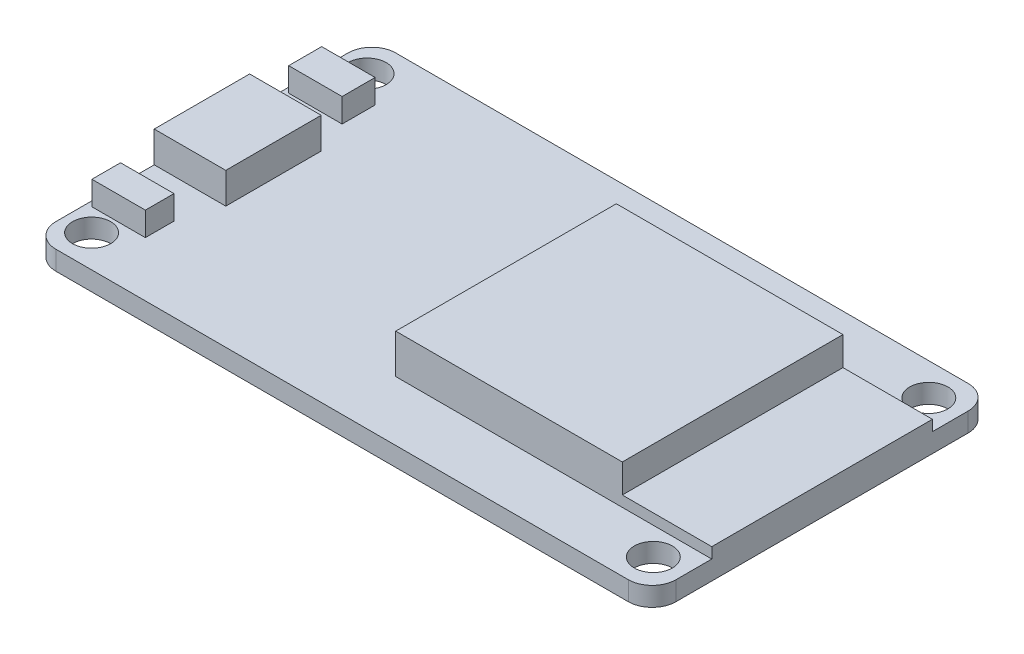
ISO-10303-21;
HEADER;
FILE_DESCRIPTION(('STEP AP214'),'2;1');
FILE_NAME('part.step','',(''),(''),'','','');
FILE_SCHEMA(('AUTOMOTIVE_DESIGN { 1 0 10303 214 1 1 1 1 }'));
ENDSEC;
DATA;
#1=APPLICATION_CONTEXT('core data for automotive mechanical design processes');
#2=APPLICATION_PROTOCOL_DEFINITION('international standard','automotive_design',2000,#1);
#3=PRODUCT_CONTEXT('',#1,'mechanical');
#4=PRODUCT('Part','Part','',(#3));
#5=PRODUCT_RELATED_PRODUCT_CATEGORY('part','',(#4));
#6=PRODUCT_DEFINITION_FORMATION('','',#4);
#7=PRODUCT_DEFINITION_CONTEXT('part definition',#1,'design');
#8=PRODUCT_DEFINITION('design','',#6,#7);
#9=PRODUCT_DEFINITION_SHAPE('','',#8);
#10=(LENGTH_UNIT() NAMED_UNIT(*) SI_UNIT(.MILLI.,.METRE.));
#11=(NAMED_UNIT(*) PLANE_ANGLE_UNIT() SI_UNIT($,.RADIAN.));
#12=(NAMED_UNIT(*) SI_UNIT($,.STERADIAN.) SOLID_ANGLE_UNIT());
#13=UNCERTAINTY_MEASURE_WITH_UNIT(LENGTH_MEASURE(1.E-05),#10,'distance_accuracy_value','');
#14=(GEOMETRIC_REPRESENTATION_CONTEXT(3) GLOBAL_UNCERTAINTY_ASSIGNED_CONTEXT((#13)) GLOBAL_UNIT_ASSIGNED_CONTEXT((#10,
#11,#12)) REPRESENTATION_CONTEXT('',''));
#15=CARTESIAN_POINT('',(0.,0.,0.));
#16=DIRECTION('',(0.,0.,1.));
#17=DIRECTION('',(1.,0.,0.));
#18=AXIS2_PLACEMENT_3D('',#15,#16,#17);
#19=CARTESIAN_POINT('',(0.,1.6,0.));
#20=DIRECTION('',(0.,1.,0.));
#21=DIRECTION('',(0.,0.,1.));
#22=AXIS2_PLACEMENT_3D('',#19,#20,#21);
#23=PLANE('',#22);
#24=CARTESIAN_POINT('',(23.4,1.6,-11.55));
#25=DIRECTION('',(0.,1.,0.));
#26=DIRECTION('',(0.,0.,1.));
#27=AXIS2_PLACEMENT_3D('',#24,#25,#26);
#28=CIRCLE('',#27,1.6);
#29=CARTESIAN_POINT('',(23.4,1.6,-9.95));
#30=VERTEX_POINT('',#29);
#31=EDGE_CURVE('E354',#30,#30,#28,.T.);
#32=ORIENTED_EDGE('',*,*,#31,.F.);
#33=EDGE_LOOP('',(#32));
#34=FACE_BOUND('',#33,.T.);
#35=CARTESIAN_POINT('',(23.4,1.6,11.55));
#36=DIRECTION('',(0.,1.,0.));
#37=DIRECTION('',(0.,0.,1.));
#38=AXIS2_PLACEMENT_3D('',#35,#36,#37);
#39=CIRCLE('',#38,1.6);
#40=CARTESIAN_POINT('',(23.4,1.6,13.15));
#41=VERTEX_POINT('',#40);
#42=EDGE_CURVE('E366',#41,#41,#39,.T.);
#43=ORIENTED_EDGE('',*,*,#42,.F.);
#44=EDGE_LOOP('',(#43));
#45=FACE_BOUND('',#44,.T.);
#46=CARTESIAN_POINT('',(-23.7,1.6,-11.55));
#47=DIRECTION('',(0.,1.,0.));
#48=DIRECTION('',(0.,0.,1.));
#49=AXIS2_PLACEMENT_3D('',#46,#47,#48);
#50=CIRCLE('',#49,1.6);
#51=CARTESIAN_POINT('',(-23.7,1.6,-9.95));
#52=VERTEX_POINT('',#51);
#53=EDGE_CURVE('E360',#52,#52,#50,.T.);
#54=ORIENTED_EDGE('',*,*,#53,.F.);
#55=EDGE_LOOP('',(#54));
#56=FACE_BOUND('',#55,.T.);
#57=CARTESIAN_POINT('',(-23.7,1.6,11.55));
#58=DIRECTION('',(0.,1.,0.));
#59=DIRECTION('',(0.,0.,1.));
#60=AXIS2_PLACEMENT_3D('',#57,#58,#59);
#61=CIRCLE('',#60,1.6);
#62=CARTESIAN_POINT('',(-23.7,1.6,13.15));
#63=VERTEX_POINT('',#62);
#64=EDGE_CURVE('E348',#63,#63,#61,.T.);
#65=ORIENTED_EDGE('',*,*,#64,.F.);
#66=EDGE_LOOP('',(#65));
#67=FACE_BOUND('',#66,.T.);
#68=DIRECTION('',(0.,0.,1.));
#69=VECTOR('',#68,1.);
#70=CARTESIAN_POINT('',(-0.5,1.6,9.25000000000001));
#71=LINE('',#70,#69);
#72=CARTESIAN_POINT('',(-0.500000000000004,1.6,-9.25));
#73=VERTEX_POINT('',#72);
#74=CARTESIAN_POINT('',(-0.5,1.6,9.25000000000001));
#75=VERTEX_POINT('',#74);
#76=EDGE_CURVE('E301',#73,#75,#71,.T.);
#77=ORIENTED_EDGE('',*,*,#76,.F.);
#78=DIRECTION('',(-1.,0.,0.));
#79=VECTOR('',#78,1.);
#80=CARTESIAN_POINT('',(26.,1.6,-9.25));
#81=LINE('',#80,#79);
#82=CARTESIAN_POINT('',(26.,1.6,-9.25));
#83=VERTEX_POINT('',#82);
#84=EDGE_CURVE('E289',#83,#73,#81,.T.);
#85=ORIENTED_EDGE('',*,*,#84,.F.);
#86=DIRECTION('',(0.,0.,-1.));
#87=VECTOR('',#86,1.);
#88=CARTESIAN_POINT('',(26.,1.6,14.25));
#89=LINE('',#88,#87);
#90=CARTESIAN_POINT('',(26.,1.6,-12.25));
#91=VERTEX_POINT('',#90);
#92=EDGE_CURVE('E378',#83,#91,#89,.T.);
#93=ORIENTED_EDGE('',*,*,#92,.T.);
#94=CARTESIAN_POINT('',(24.,1.6,-12.25));
#95=DIRECTION('',(0.,1.,0.));
#96=DIRECTION('',(0.,0.,1.));
#97=AXIS2_PLACEMENT_3D('',#94,#95,#96);
#98=CIRCLE('',#97,2.);
#99=CARTESIAN_POINT('',(24.,1.6,-14.25));
#100=VERTEX_POINT('',#99);
#101=EDGE_CURVE('E420',#91,#100,#98,.T.);
#102=ORIENTED_EDGE('',*,*,#101,.T.);
#103=DIRECTION('',(-1.,0.,0.));
#104=VECTOR('',#103,1.);
#105=CARTESIAN_POINT('',(26.,1.6,-14.25));
#106=LINE('',#105,#104);
#107=CARTESIAN_POINT('',(-24.,1.6,-14.25));
#108=VERTEX_POINT('',#107);
#109=EDGE_CURVE('E381',#100,#108,#106,.T.);
#110=ORIENTED_EDGE('',*,*,#109,.T.);
#111=CARTESIAN_POINT('',(-24.,1.6,-12.25));
#112=DIRECTION('',(0.,1.,0.));
#113=DIRECTION('',(0.,0.,1.));
#114=AXIS2_PLACEMENT_3D('',#111,#112,#113);
#115=CIRCLE('',#114,2.);
#116=CARTESIAN_POINT('',(-26.,1.6,-12.25));
#117=VERTEX_POINT('',#116);
#118=EDGE_CURVE('E416',#108,#117,#115,.T.);
#119=ORIENTED_EDGE('',*,*,#118,.T.);
#120=DIRECTION('',(0.,0.,1.));
#121=VECTOR('',#120,1.);
#122=CARTESIAN_POINT('',(-26.,1.6,14.25));
#123=LINE('',#122,#121);
#124=CARTESIAN_POINT('',(-26.,1.6,-3.99999999999999));
#125=VERTEX_POINT('',#124);
#126=EDGE_CURVE('E372',#117,#125,#123,.T.);
#127=ORIENTED_EDGE('',*,*,#126,.T.);
#128=DIRECTION('',(-1.,0.,0.));
#129=VECTOR('',#128,1.);
#130=CARTESIAN_POINT('',(-26.,1.6,-4.));
#131=LINE('',#130,#129);
#132=CARTESIAN_POINT('',(-20.,1.6,-4.));
#133=VERTEX_POINT('',#132);
#134=EDGE_CURVE('E322',#133,#125,#131,.T.);
#135=ORIENTED_EDGE('',*,*,#134,.F.);
#136=DIRECTION('',(0.,0.,-1.));
#137=VECTOR('',#136,1.);
#138=CARTESIAN_POINT('',(-20.,1.6,4.));
#139=LINE('',#138,#137);
#140=CARTESIAN_POINT('',(-20.,1.6,4.));
#141=VERTEX_POINT('',#140);
#142=EDGE_CURVE('E331',#141,#133,#139,.T.);
#143=ORIENTED_EDGE('',*,*,#142,.F.);
#144=DIRECTION('',(1.,0.,0.));
#145=VECTOR('',#144,1.);
#146=CARTESIAN_POINT('',(-26.,1.6,4.));
#147=LINE('',#146,#145);
#148=CARTESIAN_POINT('',(-26.,1.6,4.));
#149=VERTEX_POINT('',#148);
#150=EDGE_CURVE('E317',#149,#141,#147,.T.);
#151=ORIENTED_EDGE('',*,*,#150,.F.);
#152=CARTESIAN_POINT('',(-26.,1.6,12.25));
#153=VERTEX_POINT('',#152);
#154=EDGE_CURVE('E375',#149,#153,#123,.T.);
#155=ORIENTED_EDGE('',*,*,#154,.T.);
#156=CARTESIAN_POINT('',(-24.,1.6,12.25));
#157=DIRECTION('',(0.,1.,0.));
#158=DIRECTION('',(0.,0.,1.));
#159=AXIS2_PLACEMENT_3D('',#156,#157,#158);
#160=CIRCLE('',#159,2.);
#161=CARTESIAN_POINT('',(-24.,1.6,14.25));
#162=VERTEX_POINT('',#161);
#163=EDGE_CURVE('E414',#153,#162,#160,.T.);
#164=ORIENTED_EDGE('',*,*,#163,.T.);
#165=DIRECTION('',(1.,0.,0.));
#166=VECTOR('',#165,1.);
#167=CARTESIAN_POINT('',(26.,1.6,14.25));
#168=LINE('',#167,#166);
#169=CARTESIAN_POINT('',(24.,1.6,14.25));
#170=VERTEX_POINT('',#169);
#171=EDGE_CURVE('E374',#162,#170,#168,.T.);
#172=ORIENTED_EDGE('',*,*,#171,.T.);
#173=CARTESIAN_POINT('',(24.,1.6,12.25));
#174=DIRECTION('',(0.,1.,0.));
#175=DIRECTION('',(0.,0.,1.));
#176=AXIS2_PLACEMENT_3D('',#173,#174,#175);
#177=CIRCLE('',#176,2.);
#178=CARTESIAN_POINT('',(26.,1.6,12.25));
#179=VERTEX_POINT('',#178);
#180=EDGE_CURVE('E418',#170,#179,#177,.T.);
#181=ORIENTED_EDGE('',*,*,#180,.T.);
#182=CARTESIAN_POINT('',(26.,1.6,9.25000000000001));
#183=VERTEX_POINT('',#182);
#184=EDGE_CURVE('E379',#179,#183,#89,.T.);
#185=ORIENTED_EDGE('',*,*,#184,.T.);
#186=DIRECTION('',(1.,0.,0.));
#187=VECTOR('',#186,1.);
#188=CARTESIAN_POINT('',(26.,1.6,9.25));
#189=LINE('',#188,#187);
#190=EDGE_CURVE('E294',#75,#183,#189,.T.);
#191=ORIENTED_EDGE('',*,*,#190,.F.);
#192=EDGE_LOOP('',(#77,#85,#93,#102,#110,#119,#127,#135,#143,#151,#155,#164,#172,#181,#185,#191));
#193=FACE_BOUND('',#192,.T.);
#194=DIRECTION('',(1.,0.,0.));
#195=VECTOR('',#194,1.);
#196=CARTESIAN_POINT('',(-25.5637665283371,1.6,-6.83896640629226));
#197=LINE('',#196,#195);
#198=CARTESIAN_POINT('',(-25.5637665283371,1.6,-6.83896640629226));
#199=VERTEX_POINT('',#198);
#200=CARTESIAN_POINT('',(-21.0835187862574,1.6,-6.83896640629226));
#201=VERTEX_POINT('',#200);
#202=EDGE_CURVE('E236',#199,#201,#197,.T.);
#203=ORIENTED_EDGE('',*,*,#202,.F.);
#204=DIRECTION('',(0.,0.,1.));
#205=VECTOR('',#204,1.);
#206=CARTESIAN_POINT('',(-25.5637665283371,1.6,-9.60617824698855));
#207=LINE('',#206,#205);
#208=CARTESIAN_POINT('',(-25.5637665283371,1.6,-9.60617824698855));
#209=VERTEX_POINT('',#208);
#210=EDGE_CURVE('E233',#209,#199,#207,.T.);
#211=ORIENTED_EDGE('',*,*,#210,.F.);
#212=DIRECTION('',(-1.,0.,0.));
#213=VECTOR('',#212,1.);
#214=CARTESIAN_POINT('',(-25.5637665283371,1.6,-9.60617824698855));
#215=LINE('',#214,#213);
#216=CARTESIAN_POINT('',(-21.0835187862574,1.6,-9.60617824698855));
#217=VERTEX_POINT('',#216);
#218=EDGE_CURVE('E251',#217,#209,#215,.T.);
#219=ORIENTED_EDGE('',*,*,#218,.F.);
#220=DIRECTION('',(0.,0.,-1.));
#221=VECTOR('',#220,1.);
#222=CARTESIAN_POINT('',(-21.0835187862574,1.6,-9.60617824698855));
#223=LINE('',#222,#221);
#224=EDGE_CURVE('E259',#201,#217,#223,.T.);
#225=ORIENTED_EDGE('',*,*,#224,.F.);
#226=EDGE_LOOP('',(#203,#211,#219,#225));
#227=FACE_BOUND('',#226,.T.);
#228=DIRECTION('',(1.,0.,0.));
#229=VECTOR('',#228,1.);
#230=CARTESIAN_POINT('',(-25.5637665283371,1.6,9.65888704395417));
#231=LINE('',#230,#229);
#232=CARTESIAN_POINT('',(-25.5637665283371,1.6,9.65888704395417));
#233=VERTEX_POINT('',#232);
#234=CARTESIAN_POINT('',(-21.0835187862574,1.6,9.65888704395417));
#235=VERTEX_POINT('',#234);
#236=EDGE_CURVE('E232',#233,#235,#231,.T.);
#237=ORIENTED_EDGE('',*,*,#236,.F.);
#238=DIRECTION('',(0.,0.,1.));
#239=VECTOR('',#238,1.);
#240=CARTESIAN_POINT('',(-25.5637665283371,1.6,7.26063678201739));
#241=LINE('',#240,#239);
#242=CARTESIAN_POINT('',(-25.5637665283371,1.6,7.26063678201739));
#243=VERTEX_POINT('',#242);
#244=EDGE_CURVE('E227',#243,#233,#241,.T.);
#245=ORIENTED_EDGE('',*,*,#244,.F.);
#246=DIRECTION('',(-1.,0.,0.));
#247=VECTOR('',#246,1.);
#248=CARTESIAN_POINT('',(-25.5637665283371,1.6,7.26063678201739));
#249=LINE('',#248,#247);
#250=CARTESIAN_POINT('',(-21.0835187862574,1.6,7.26063678201739));
#251=VERTEX_POINT('',#250);
#252=EDGE_CURVE('E212',#251,#243,#249,.T.);
#253=ORIENTED_EDGE('',*,*,#252,.F.);
#254=DIRECTION('',(0.,0.,-1.));
#255=VECTOR('',#254,1.);
#256=CARTESIAN_POINT('',(-21.0835187862574,1.6,7.26063678201739));
#257=LINE('',#256,#255);
#258=EDGE_CURVE('E220',#235,#251,#257,.T.);
#259=ORIENTED_EDGE('',*,*,#258,.F.);
#260=EDGE_LOOP('',(#237,#245,#253,#259));
#261=FACE_BOUND('',#260,.T.);
#262=ADVANCED_FACE('F38',(#34,#45,#56,#67,#193,#227,#261),#23,.T.);
#263=CARTESIAN_POINT('',(0.,0.,0.));
#264=DIRECTION('',(0.,1.,0.));
#265=DIRECTION('',(0.,0.,1.));
#266=AXIS2_PLACEMENT_3D('',#263,#264,#265);
#267=PLANE('',#266);
#268=DIRECTION('',(-1.,0.,0.));
#269=VECTOR('',#268,1.);
#270=CARTESIAN_POINT('',(26.,0.,-14.25));
#271=LINE('',#270,#269);
#272=CARTESIAN_POINT('',(24.,0.,-14.25));
#273=VERTEX_POINT('',#272);
#274=CARTESIAN_POINT('',(-24.,0.,-14.25));
#275=VERTEX_POINT('',#274);
#276=EDGE_CURVE('E393',#273,#275,#271,.T.);
#277=ORIENTED_EDGE('',*,*,#276,.F.);
#278=CARTESIAN_POINT('',(24.,0.,-12.25));
#279=DIRECTION('',(0.,1.,0.));
#280=DIRECTION('',(0.,0.,1.));
#281=AXIS2_PLACEMENT_3D('',#278,#279,#280);
#282=CIRCLE('',#281,2.);
#283=CARTESIAN_POINT('',(26.,0.,-12.25));
#284=VERTEX_POINT('',#283);
#285=EDGE_CURVE('E406',#273,#284,#282,.F.);
#286=ORIENTED_EDGE('',*,*,#285,.T.);
#287=DIRECTION('',(0.,0.,-1.));
#288=VECTOR('',#287,1.);
#289=CARTESIAN_POINT('',(26.,0.,14.25));
#290=LINE('',#289,#288);
#291=CARTESIAN_POINT('',(26.,0.,12.25));
#292=VERTEX_POINT('',#291);
#293=EDGE_CURVE('E390',#292,#284,#290,.T.);
#294=ORIENTED_EDGE('',*,*,#293,.F.);
#295=CARTESIAN_POINT('',(24.,0.,12.25));
#296=DIRECTION('',(0.,1.,0.));
#297=DIRECTION('',(0.,0.,1.));
#298=AXIS2_PLACEMENT_3D('',#295,#296,#297);
#299=CIRCLE('',#298,2.);
#300=CARTESIAN_POINT('',(24.,0.,14.25));
#301=VERTEX_POINT('',#300);
#302=EDGE_CURVE('E404',#292,#301,#299,.F.);
#303=ORIENTED_EDGE('',*,*,#302,.T.);
#304=DIRECTION('',(1.,0.,0.));
#305=VECTOR('',#304,1.);
#306=CARTESIAN_POINT('',(26.,0.,14.25));
#307=LINE('',#306,#305);
#308=CARTESIAN_POINT('',(-24.,0.,14.25));
#309=VERTEX_POINT('',#308);
#310=EDGE_CURVE('E387',#309,#301,#307,.T.);
#311=ORIENTED_EDGE('',*,*,#310,.F.);
#312=CARTESIAN_POINT('',(-24.,0.,12.25));
#313=DIRECTION('',(0.,1.,0.));
#314=DIRECTION('',(0.,0.,1.));
#315=AXIS2_PLACEMENT_3D('',#312,#313,#314);
#316=CIRCLE('',#315,2.);
#317=CARTESIAN_POINT('',(-26.,0.,12.25));
#318=VERTEX_POINT('',#317);
#319=EDGE_CURVE('E400',#309,#318,#316,.F.);
#320=ORIENTED_EDGE('',*,*,#319,.T.);
#321=DIRECTION('',(0.,0.,1.));
#322=VECTOR('',#321,1.);
#323=CARTESIAN_POINT('',(-26.,0.,14.25));
#324=LINE('',#323,#322);
#325=CARTESIAN_POINT('',(-26.,0.,-12.25));
#326=VERTEX_POINT('',#325);
#327=EDGE_CURVE('E369',#326,#318,#324,.T.);
#328=ORIENTED_EDGE('',*,*,#327,.F.);
#329=CARTESIAN_POINT('',(-24.,0.,-12.25));
#330=DIRECTION('',(0.,1.,0.));
#331=DIRECTION('',(0.,0.,1.));
#332=AXIS2_PLACEMENT_3D('',#329,#330,#331);
#333=CIRCLE('',#332,2.);
#334=EDGE_CURVE('E402',#326,#275,#333,.F.);
#335=ORIENTED_EDGE('',*,*,#334,.T.);
#336=EDGE_LOOP('',(#277,#286,#294,#303,#311,#320,#328,#335));
#337=FACE_BOUND('',#336,.T.);
#338=CARTESIAN_POINT('',(23.4,0.,11.55));
#339=DIRECTION('',(0.,1.,0.));
#340=DIRECTION('',(0.,0.,1.));
#341=AXIS2_PLACEMENT_3D('',#338,#339,#340);
#342=CIRCLE('',#341,1.6);
#343=CARTESIAN_POINT('',(23.4,0.,13.15));
#344=VERTEX_POINT('',#343);
#345=EDGE_CURVE('E363',#344,#344,#342,.T.);
#346=ORIENTED_EDGE('',*,*,#345,.T.);
#347=EDGE_LOOP('',(#346));
#348=FACE_BOUND('',#347,.T.);
#349=CARTESIAN_POINT('',(-23.7,0.,-11.55));
#350=DIRECTION('',(0.,1.,0.));
#351=DIRECTION('',(0.,0.,1.));
#352=AXIS2_PLACEMENT_3D('',#349,#350,#351);
#353=CIRCLE('',#352,1.6);
#354=CARTESIAN_POINT('',(-23.7,0.,-9.95));
#355=VERTEX_POINT('',#354);
#356=EDGE_CURVE('E357',#355,#355,#353,.T.);
#357=ORIENTED_EDGE('',*,*,#356,.T.);
#358=EDGE_LOOP('',(#357));
#359=FACE_BOUND('',#358,.T.);
#360=CARTESIAN_POINT('',(23.4,0.,-11.55));
#361=DIRECTION('',(0.,1.,0.));
#362=DIRECTION('',(0.,0.,1.));
#363=AXIS2_PLACEMENT_3D('',#360,#361,#362);
#364=CIRCLE('',#363,1.6);
#365=CARTESIAN_POINT('',(23.4,0.,-9.95));
#366=VERTEX_POINT('',#365);
#367=EDGE_CURVE('E351',#366,#366,#364,.T.);
#368=ORIENTED_EDGE('',*,*,#367,.T.);
#369=EDGE_LOOP('',(#368));
#370=FACE_BOUND('',#369,.T.);
#371=CARTESIAN_POINT('',(-23.7,0.,11.55));
#372=DIRECTION('',(0.,1.,0.));
#373=DIRECTION('',(0.,0.,1.));
#374=AXIS2_PLACEMENT_3D('',#371,#372,#373);
#375=CIRCLE('',#374,1.6);
#376=CARTESIAN_POINT('',(-23.7,0.,13.15));
#377=VERTEX_POINT('',#376);
#378=EDGE_CURVE('E347',#377,#377,#375,.T.);
#379=ORIENTED_EDGE('',*,*,#378,.T.);
#380=EDGE_LOOP('',(#379));
#381=FACE_BOUND('',#380,.T.);
#382=ADVANCED_FACE('F487',(#337,#348,#359,#370,#381),#267,.F.);
#383=CARTESIAN_POINT('',(-26.,1.6,14.25));
#384=DIRECTION('',(1.,0.,0.));
#385=DIRECTION('',(0.,0.,-1.));
#386=AXIS2_PLACEMENT_3D('',#383,#384,#385);
#387=PLANE('',#386);
#388=ORIENTED_EDGE('',*,*,#126,.F.);
#389=DIRECTION('',(0.,-1.,0.));
#390=VECTOR('',#389,1.);
#391=CARTESIAN_POINT('',(-26.,1.6,-12.25));
#392=LINE('',#391,#390);
#393=EDGE_CURVE('E11',#117,#326,#392,.T.);
#394=ORIENTED_EDGE('',*,*,#393,.T.);
#395=ORIENTED_EDGE('',*,*,#327,.T.);
#396=DIRECTION('',(0.,-1.,0.));
#397=VECTOR('',#396,1.);
#398=CARTESIAN_POINT('',(-26.,1.6,12.25));
#399=LINE('',#398,#397);
#400=EDGE_CURVE('E46',#318,#153,#399,.F.);
#401=ORIENTED_EDGE('',*,*,#400,.T.);
#402=ORIENTED_EDGE('',*,*,#154,.F.);
#403=DIRECTION('',(0.,-1.,0.));
#404=VECTOR('',#403,1.);
#405=CARTESIAN_POINT('',(-26.,4.2,4.));
#406=LINE('',#405,#404);
#407=CARTESIAN_POINT('',(-26.,4.2,4.));
#408=VERTEX_POINT('',#407);
#409=EDGE_CURVE('E344',#408,#149,#406,.T.);
#410=ORIENTED_EDGE('',*,*,#409,.F.);
#411=DIRECTION('',(0.,0.,1.));
#412=VECTOR('',#411,1.);
#413=CARTESIAN_POINT('',(-26.,4.2,4.));
#414=LINE('',#413,#412);
#415=CARTESIAN_POINT('',(-26.,4.2,-4.));
#416=VERTEX_POINT('',#415);
#417=EDGE_CURVE('E318',#416,#408,#414,.T.);
#418=ORIENTED_EDGE('',*,*,#417,.F.);
#419=DIRECTION('',(0.,-1.,0.));
#420=VECTOR('',#419,1.);
#421=CARTESIAN_POINT('',(-26.,4.2,-4.));
#422=LINE('',#421,#420);
#423=EDGE_CURVE('E328',#416,#125,#422,.T.);
#424=ORIENTED_EDGE('',*,*,#423,.T.);
#425=EDGE_LOOP('',(#388,#394,#395,#401,#402,#410,#418,#424));
#426=FACE_BOUND('',#425,.T.);
#427=ADVANCED_FACE('F432',(#426),#387,.F.);
#428=CARTESIAN_POINT('',(26.,1.6,14.25));
#429=DIRECTION('',(0.,0.,-1.));
#430=DIRECTION('',(-1.,0.,0.));
#431=AXIS2_PLACEMENT_3D('',#428,#429,#430);
#432=PLANE('',#431);
#433=ORIENTED_EDGE('',*,*,#310,.T.);
#434=DIRECTION('',(0.,-1.,0.));
#435=VECTOR('',#434,1.);
#436=CARTESIAN_POINT('',(24.,1.6,14.25));
#437=LINE('',#436,#435);
#438=EDGE_CURVE('E425',#301,#170,#437,.F.);
#439=ORIENTED_EDGE('',*,*,#438,.T.);
#440=ORIENTED_EDGE('',*,*,#171,.F.);
#441=DIRECTION('',(0.,-1.,0.));
#442=VECTOR('',#441,1.);
#443=CARTESIAN_POINT('',(-24.,1.6,14.25));
#444=LINE('',#443,#442);
#445=EDGE_CURVE('E422',#162,#309,#444,.T.);
#446=ORIENTED_EDGE('',*,*,#445,.T.);
#447=EDGE_LOOP('',(#433,#439,#440,#446));
#448=FACE_BOUND('',#447,.T.);
#449=ADVANCED_FACE('F442',(#448),#432,.F.);
#450=CARTESIAN_POINT('',(26.,1.6,14.25));
#451=DIRECTION('',(-1.,0.,0.));
#452=DIRECTION('',(0.,0.,1.));
#453=AXIS2_PLACEMENT_3D('',#450,#451,#452);
#454=PLANE('',#453);
#455=ORIENTED_EDGE('',*,*,#293,.T.);
#456=DIRECTION('',(0.,-1.,0.));
#457=VECTOR('',#456,1.);
#458=CARTESIAN_POINT('',(26.,1.6,-12.25));
#459=LINE('',#458,#457);
#460=EDGE_CURVE('E411',#284,#91,#459,.F.);
#461=ORIENTED_EDGE('',*,*,#460,.T.);
#462=ORIENTED_EDGE('',*,*,#92,.F.);
#463=DIRECTION('',(0.,-1.,0.));
#464=VECTOR('',#463,1.);
#465=CARTESIAN_POINT('',(26.,2.5,-9.25));
#466=LINE('',#465,#464);
#467=CARTESIAN_POINT('',(26.,2.5,-9.25));
#468=VERTEX_POINT('',#467);
#469=EDGE_CURVE('E314',#468,#83,#466,.T.);
#470=ORIENTED_EDGE('',*,*,#469,.F.);
#471=DIRECTION('',(0.,0.,-1.));
#472=VECTOR('',#471,1.);
#473=CARTESIAN_POINT('',(26.,2.5,9.25));
#474=LINE('',#473,#472);
#475=CARTESIAN_POINT('',(26.,2.5,9.25));
#476=VERTEX_POINT('',#475);
#477=EDGE_CURVE('E290',#476,#468,#474,.T.);
#478=ORIENTED_EDGE('',*,*,#477,.F.);
#479=DIRECTION('',(0.,-1.,0.));
#480=VECTOR('',#479,1.);
#481=CARTESIAN_POINT('',(26.,2.5,9.25));
#482=LINE('',#481,#480);
#483=EDGE_CURVE('E298',#476,#183,#482,.T.);
#484=ORIENTED_EDGE('',*,*,#483,.T.);
#485=ORIENTED_EDGE('',*,*,#184,.F.);
#486=DIRECTION('',(0.,-1.,0.));
#487=VECTOR('',#486,1.);
#488=CARTESIAN_POINT('',(26.,1.6,12.25));
#489=LINE('',#488,#487);
#490=EDGE_CURVE('E408',#179,#292,#489,.T.);
#491=ORIENTED_EDGE('',*,*,#490,.T.);
#492=EDGE_LOOP('',(#455,#461,#462,#470,#478,#484,#485,#491));
#493=FACE_BOUND('',#492,.T.);
#494=ADVANCED_FACE('F450',(#493),#454,.F.);
#495=CARTESIAN_POINT('',(26.,1.6,-14.25));
#496=DIRECTION('',(0.,0.,1.));
#497=DIRECTION('',(1.,0.,0.));
#498=AXIS2_PLACEMENT_3D('',#495,#496,#497);
#499=PLANE('',#498);
#500=ORIENTED_EDGE('',*,*,#109,.F.);
#501=DIRECTION('',(0.,-1.,0.));
#502=VECTOR('',#501,1.);
#503=CARTESIAN_POINT('',(24.,1.6,-14.25));
#504=LINE('',#503,#502);
#505=EDGE_CURVE('E397',#100,#273,#504,.T.);
#506=ORIENTED_EDGE('',*,*,#505,.T.);
#507=ORIENTED_EDGE('',*,*,#276,.T.);
#508=DIRECTION('',(0.,-1.,0.));
#509=VECTOR('',#508,1.);
#510=CARTESIAN_POINT('',(-24.,1.6,-14.25));
#511=LINE('',#510,#509);
#512=EDGE_CURVE('E384',#275,#108,#511,.F.);
#513=ORIENTED_EDGE('',*,*,#512,.T.);
#514=EDGE_LOOP('',(#500,#506,#507,#513));
#515=FACE_BOUND('',#514,.T.);
#516=ADVANCED_FACE('F482',(#515),#499,.F.);
#517=CARTESIAN_POINT('',(23.4,1.6,11.55));
#518=DIRECTION('',(0.,-1.,0.));
#519=DIRECTION('',(0.,0.,-1.));
#520=AXIS2_PLACEMENT_3D('',#517,#518,#519);
#521=CYLINDRICAL_SURFACE('',#520,1.6);
#522=ORIENTED_EDGE('',*,*,#42,.T.);
#523=EDGE_LOOP('',(#522));
#524=FACE_BOUND('',#523,.T.);
#525=ORIENTED_EDGE('',*,*,#345,.F.);
#526=EDGE_LOOP('',(#525));
#527=FACE_BOUND('',#526,.T.);
#528=ADVANCED_FACE('F524',(#524,#527),#521,.F.);
#529=CARTESIAN_POINT('',(-23.7,1.6,-11.55));
#530=DIRECTION('',(0.,-1.,0.));
#531=DIRECTION('',(0.,0.,-1.));
#532=AXIS2_PLACEMENT_3D('',#529,#530,#531);
#533=CYLINDRICAL_SURFACE('',#532,1.6);
#534=ORIENTED_EDGE('',*,*,#53,.T.);
#535=EDGE_LOOP('',(#534));
#536=FACE_BOUND('',#535,.T.);
#537=ORIENTED_EDGE('',*,*,#356,.F.);
#538=EDGE_LOOP('',(#537));
#539=FACE_BOUND('',#538,.T.);
#540=ADVANCED_FACE('F557',(#536,#539),#533,.F.);
#541=CARTESIAN_POINT('',(23.4,1.6,-11.55));
#542=DIRECTION('',(0.,-1.,0.));
#543=DIRECTION('',(0.,0.,-1.));
#544=AXIS2_PLACEMENT_3D('',#541,#542,#543);
#545=CYLINDRICAL_SURFACE('',#544,1.6);
#546=ORIENTED_EDGE('',*,*,#31,.T.);
#547=EDGE_LOOP('',(#546));
#548=FACE_BOUND('',#547,.T.);
#549=ORIENTED_EDGE('',*,*,#367,.F.);
#550=EDGE_LOOP('',(#549));
#551=FACE_BOUND('',#550,.T.);
#552=ADVANCED_FACE('F554',(#548,#551),#545,.F.);
#553=CARTESIAN_POINT('',(-23.7,1.6,11.55));
#554=DIRECTION('',(0.,-1.,0.));
#555=DIRECTION('',(0.,0.,-1.));
#556=AXIS2_PLACEMENT_3D('',#553,#554,#555);
#557=CYLINDRICAL_SURFACE('',#556,1.6);
#558=ORIENTED_EDGE('',*,*,#64,.T.);
#559=EDGE_LOOP('',(#558));
#560=FACE_BOUND('',#559,.T.);
#561=ORIENTED_EDGE('',*,*,#378,.F.);
#562=EDGE_LOOP('',(#561));
#563=FACE_BOUND('',#562,.T.);
#564=ADVANCED_FACE('F537',(#560,#563),#557,.F.);
#565=CARTESIAN_POINT('',(24.,1.6,-12.25));
#566=DIRECTION('',(0.,-1.,0.));
#567=DIRECTION('',(0.,0.,-1.));
#568=AXIS2_PLACEMENT_3D('',#565,#566,#567);
#569=CYLINDRICAL_SURFACE('',#568,2.);
#570=ORIENTED_EDGE('',*,*,#101,.F.);
#571=ORIENTED_EDGE('',*,*,#460,.F.);
#572=ORIENTED_EDGE('',*,*,#285,.F.);
#573=ORIENTED_EDGE('',*,*,#505,.F.);
#574=EDGE_LOOP('',(#570,#571,#572,#573));
#575=FACE_BOUND('',#574,.T.);
#576=ADVANCED_FACE('F485',(#575),#569,.T.);
#577=CARTESIAN_POINT('',(24.,1.6,12.25));
#578=DIRECTION('',(0.,-1.,0.));
#579=DIRECTION('',(0.,0.,-1.));
#580=AXIS2_PLACEMENT_3D('',#577,#578,#579);
#581=CYLINDRICAL_SURFACE('',#580,2.);
#582=ORIENTED_EDGE('',*,*,#180,.F.);
#583=ORIENTED_EDGE('',*,*,#438,.F.);
#584=ORIENTED_EDGE('',*,*,#302,.F.);
#585=ORIENTED_EDGE('',*,*,#490,.F.);
#586=EDGE_LOOP('',(#582,#583,#584,#585));
#587=FACE_BOUND('',#586,.T.);
#588=ADVANCED_FACE('F446',(#587),#581,.T.);
#589=CARTESIAN_POINT('',(-24.,1.6,-12.25));
#590=DIRECTION('',(0.,-1.,0.));
#591=DIRECTION('',(0.,0.,-1.));
#592=AXIS2_PLACEMENT_3D('',#589,#590,#591);
#593=CYLINDRICAL_SURFACE('',#592,2.);
#594=ORIENTED_EDGE('',*,*,#118,.F.);
#595=ORIENTED_EDGE('',*,*,#512,.F.);
#596=ORIENTED_EDGE('',*,*,#334,.F.);
#597=ORIENTED_EDGE('',*,*,#393,.F.);
#598=EDGE_LOOP('',(#594,#595,#596,#597));
#599=FACE_BOUND('',#598,.T.);
#600=ADVANCED_FACE('F490',(#599),#593,.T.);
#601=CARTESIAN_POINT('',(-24.,1.6,12.25));
#602=DIRECTION('',(0.,-1.,0.));
#603=DIRECTION('',(0.,0.,-1.));
#604=AXIS2_PLACEMENT_3D('',#601,#602,#603);
#605=CYLINDRICAL_SURFACE('',#604,2.);
#606=ORIENTED_EDGE('',*,*,#163,.F.);
#607=ORIENTED_EDGE('',*,*,#400,.F.);
#608=ORIENTED_EDGE('',*,*,#319,.F.);
#609=ORIENTED_EDGE('',*,*,#445,.F.);
#610=EDGE_LOOP('',(#606,#607,#608,#609));
#611=FACE_BOUND('',#610,.T.);
#612=ADVANCED_FACE('F40',(#611),#605,.T.);
#613=CARTESIAN_POINT('',(-26.,4.2,4.));
#614=DIRECTION('',(0.,0.,-1.));
#615=DIRECTION('',(-1.,0.,0.));
#616=AXIS2_PLACEMENT_3D('',#613,#614,#615);
#617=PLANE('',#616);
#618=ORIENTED_EDGE('',*,*,#150,.T.);
#619=DIRECTION('',(0.,-1.,0.));
#620=VECTOR('',#619,1.);
#621=CARTESIAN_POINT('',(-20.,4.2,4.));
#622=LINE('',#621,#620);
#623=CARTESIAN_POINT('',(-20.,4.2,4.));
#624=VERTEX_POINT('',#623);
#625=EDGE_CURVE('E341',#624,#141,#622,.T.);
#626=ORIENTED_EDGE('',*,*,#625,.F.);
#627=DIRECTION('',(1.,0.,0.));
#628=VECTOR('',#627,1.);
#629=CARTESIAN_POINT('',(-26.,4.2,4.));
#630=LINE('',#629,#628);
#631=EDGE_CURVE('E321',#408,#624,#630,.T.);
#632=ORIENTED_EDGE('',*,*,#631,.F.);
#633=ORIENTED_EDGE('',*,*,#409,.T.);
#634=EDGE_LOOP('',(#618,#626,#632,#633));
#635=FACE_BOUND('',#634,.T.);
#636=ADVANCED_FACE('F503',(#635),#617,.F.);
#637=CARTESIAN_POINT('',(-20.,4.2,4.));
#638=DIRECTION('',(-1.,0.,0.));
#639=DIRECTION('',(0.,0.,1.));
#640=AXIS2_PLACEMENT_3D('',#637,#638,#639);
#641=PLANE('',#640);
#642=ORIENTED_EDGE('',*,*,#142,.T.);
#643=DIRECTION('',(0.,-1.,0.));
#644=VECTOR('',#643,1.);
#645=CARTESIAN_POINT('',(-20.,4.2,-4.));
#646=LINE('',#645,#644);
#647=CARTESIAN_POINT('',(-20.,4.2,-4.));
#648=VERTEX_POINT('',#647);
#649=EDGE_CURVE('E338',#648,#133,#646,.T.);
#650=ORIENTED_EDGE('',*,*,#649,.F.);
#651=DIRECTION('',(0.,0.,-1.));
#652=VECTOR('',#651,1.);
#653=CARTESIAN_POINT('',(-20.,4.2,4.));
#654=LINE('',#653,#652);
#655=EDGE_CURVE('E324',#624,#648,#654,.T.);
#656=ORIENTED_EDGE('',*,*,#655,.F.);
#657=ORIENTED_EDGE('',*,*,#625,.T.);
#658=EDGE_LOOP('',(#642,#650,#656,#657));
#659=FACE_BOUND('',#658,.T.);
#660=ADVANCED_FACE('F499',(#659),#641,.F.);
#661=CARTESIAN_POINT('',(-26.,4.2,-4.));
#662=DIRECTION('',(0.,0.,1.));
#663=DIRECTION('',(1.,0.,0.));
#664=AXIS2_PLACEMENT_3D('',#661,#662,#663);
#665=PLANE('',#664);
#666=ORIENTED_EDGE('',*,*,#134,.T.);
#667=ORIENTED_EDGE('',*,*,#423,.F.);
#668=DIRECTION('',(-1.,0.,0.));
#669=VECTOR('',#668,1.);
#670=CARTESIAN_POINT('',(-26.,4.2,-4.));
#671=LINE('',#670,#669);
#672=EDGE_CURVE('E326',#648,#416,#671,.T.);
#673=ORIENTED_EDGE('',*,*,#672,.F.);
#674=ORIENTED_EDGE('',*,*,#649,.T.);
#675=EDGE_LOOP('',(#666,#667,#673,#674));
#676=FACE_BOUND('',#675,.T.);
#677=ADVANCED_FACE('F496',(#676),#665,.F.);
#678=CARTESIAN_POINT('',(0.,4.2,0.));
#679=DIRECTION('',(0.,-1.,0.));
#680=DIRECTION('',(0.,0.,-1.));
#681=AXIS2_PLACEMENT_3D('',#678,#679,#680);
#682=PLANE('',#681);
#683=ORIENTED_EDGE('',*,*,#417,.T.);
#684=ORIENTED_EDGE('',*,*,#631,.T.);
#685=ORIENTED_EDGE('',*,*,#655,.T.);
#686=ORIENTED_EDGE('',*,*,#672,.T.);
#687=EDGE_LOOP('',(#683,#684,#685,#686));
#688=FACE_BOUND('',#687,.T.);
#689=ADVANCED_FACE('F505',(#688),#682,.F.);
#690=CARTESIAN_POINT('',(26.,2.5,-9.25));
#691=DIRECTION('',(0.,0.,1.));
#692=DIRECTION('',(1.,0.,0.));
#693=AXIS2_PLACEMENT_3D('',#690,#691,#692);
#694=PLANE('',#693);
#695=ORIENTED_EDGE('',*,*,#84,.T.);
#696=DIRECTION('',(0.,-1.,0.));
#697=VECTOR('',#696,1.);
#698=CARTESIAN_POINT('',(-0.500000000000004,2.5,-9.25));
#699=LINE('',#698,#697);
#700=CARTESIAN_POINT('',(-0.500000000000004,4.9,-9.25));
#701=VERTEX_POINT('',#700);
#702=EDGE_CURVE('E311',#701,#73,#699,.T.);
#703=ORIENTED_EDGE('',*,*,#702,.F.);
#704=DIRECTION('',(-1.,0.,0.));
#705=VECTOR('',#704,1.);
#706=CARTESIAN_POINT('',(-0.500000000000004,4.9,-9.25));
#707=LINE('',#706,#705);
#708=CARTESIAN_POINT('',(18.5,4.9,-9.25));
#709=VERTEX_POINT('',#708);
#710=EDGE_CURVE('E278',#709,#701,#707,.T.);
#711=ORIENTED_EDGE('',*,*,#710,.F.);
#712=DIRECTION('',(0.,-1.,0.));
#713=VECTOR('',#712,1.);
#714=CARTESIAN_POINT('',(18.5,4.9,-9.25));
#715=LINE('',#714,#713);
#716=CARTESIAN_POINT('',(18.5,2.5,-9.25));
#717=VERTEX_POINT('',#716);
#718=EDGE_CURVE('E281',#709,#717,#715,.T.);
#719=ORIENTED_EDGE('',*,*,#718,.T.);
#720=DIRECTION('',(-1.,0.,0.));
#721=VECTOR('',#720,1.);
#722=CARTESIAN_POINT('',(26.,2.5,-9.25));
#723=LINE('',#722,#721);
#724=EDGE_CURVE('E293',#468,#717,#723,.T.);
#725=ORIENTED_EDGE('',*,*,#724,.F.);
#726=ORIENTED_EDGE('',*,*,#469,.T.);
#727=EDGE_LOOP('',(#695,#703,#711,#719,#725,#726));
#728=FACE_BOUND('',#727,.T.);
#729=ADVANCED_FACE('F466',(#728),#694,.F.);
#730=CARTESIAN_POINT('',(-0.5,2.5,9.25000000000001));
#731=DIRECTION('',(1.,0.,0.));
#732=DIRECTION('',(0.,0.,-1.));
#733=AXIS2_PLACEMENT_3D('',#730,#731,#732);
#734=PLANE('',#733);
#735=ORIENTED_EDGE('',*,*,#76,.T.);
#736=DIRECTION('',(0.,-1.,0.));
#737=VECTOR('',#736,1.);
#738=CARTESIAN_POINT('',(-0.5,2.5,9.25000000000001));
#739=LINE('',#738,#737);
#740=CARTESIAN_POINT('',(-0.500000000000004,4.9,9.25000000000001));
#741=VERTEX_POINT('',#740);
#742=EDGE_CURVE('E308',#741,#75,#739,.T.);
#743=ORIENTED_EDGE('',*,*,#742,.F.);
#744=DIRECTION('',(0.,0.,1.));
#745=VECTOR('',#744,1.);
#746=CARTESIAN_POINT('',(-0.500000000000004,4.9,-9.25));
#747=LINE('',#746,#745);
#748=EDGE_CURVE('E271',#701,#741,#747,.T.);
#749=ORIENTED_EDGE('',*,*,#748,.F.);
#750=ORIENTED_EDGE('',*,*,#702,.T.);
#751=EDGE_LOOP('',(#735,#743,#749,#750));
#752=FACE_BOUND('',#751,.T.);
#753=ADVANCED_FACE('F462',(#752),#734,.F.);
#754=CARTESIAN_POINT('',(26.,2.5,9.25));
#755=DIRECTION('',(0.,0.,-1.));
#756=DIRECTION('',(-1.,0.,0.));
#757=AXIS2_PLACEMENT_3D('',#754,#755,#756);
#758=PLANE('',#757);
#759=ORIENTED_EDGE('',*,*,#190,.T.);
#760=ORIENTED_EDGE('',*,*,#483,.F.);
#761=DIRECTION('',(1.,0.,0.));
#762=VECTOR('',#761,1.);
#763=CARTESIAN_POINT('',(26.,2.5,9.25));
#764=LINE('',#763,#762);
#765=CARTESIAN_POINT('',(18.5,2.5,9.25));
#766=VERTEX_POINT('',#765);
#767=EDGE_CURVE('E296',#766,#476,#764,.T.);
#768=ORIENTED_EDGE('',*,*,#767,.F.);
#769=DIRECTION('',(0.,-1.,0.));
#770=VECTOR('',#769,1.);
#771=CARTESIAN_POINT('',(18.5,4.9,9.25000000000001));
#772=LINE('',#771,#770);
#773=CARTESIAN_POINT('',(18.5,4.9,9.25000000000001));
#774=VERTEX_POINT('',#773);
#775=EDGE_CURVE('E286',#774,#766,#772,.T.);
#776=ORIENTED_EDGE('',*,*,#775,.F.);
#777=DIRECTION('',(1.,0.,0.));
#778=VECTOR('',#777,1.);
#779=CARTESIAN_POINT('',(-0.500000000000004,4.9,9.25000000000001));
#780=LINE('',#779,#778);
#781=EDGE_CURVE('E274',#741,#774,#780,.T.);
#782=ORIENTED_EDGE('',*,*,#781,.F.);
#783=ORIENTED_EDGE('',*,*,#742,.T.);
#784=EDGE_LOOP('',(#759,#760,#768,#776,#782,#783));
#785=FACE_BOUND('',#784,.T.);
#786=ADVANCED_FACE('F457',(#785),#758,.F.);
#787=CARTESIAN_POINT('',(0.,2.5,0.));
#788=DIRECTION('',(0.,1.,0.));
#789=DIRECTION('',(0.,0.,1.));
#790=AXIS2_PLACEMENT_3D('',#787,#788,#789);
#791=PLANE('',#790);
#792=DIRECTION('',(0.,0.,-1.));
#793=VECTOR('',#792,1.);
#794=CARTESIAN_POINT('',(18.5,2.5,-9.25));
#795=LINE('',#794,#793);
#796=EDGE_CURVE('E270',#766,#717,#795,.T.);
#797=ORIENTED_EDGE('',*,*,#796,.F.);
#798=ORIENTED_EDGE('',*,*,#767,.T.);
#799=ORIENTED_EDGE('',*,*,#477,.T.);
#800=ORIENTED_EDGE('',*,*,#724,.T.);
#801=EDGE_LOOP('',(#797,#798,#799,#800));
#802=FACE_BOUND('',#801,.T.);
#803=ADVANCED_FACE('F474',(#802),#791,.T.);
#804=CARTESIAN_POINT('',(18.5,4.9,-9.25));
#805=DIRECTION('',(-1.,0.,0.));
#806=DIRECTION('',(0.,0.,1.));
#807=AXIS2_PLACEMENT_3D('',#804,#805,#806);
#808=PLANE('',#807);
#809=ORIENTED_EDGE('',*,*,#796,.T.);
#810=ORIENTED_EDGE('',*,*,#718,.F.);
#811=DIRECTION('',(0.,0.,-1.));
#812=VECTOR('',#811,1.);
#813=CARTESIAN_POINT('',(18.5,4.9,-9.25));
#814=LINE('',#813,#812);
#815=EDGE_CURVE('E276',#774,#709,#814,.T.);
#816=ORIENTED_EDGE('',*,*,#815,.F.);
#817=ORIENTED_EDGE('',*,*,#775,.T.);
#818=EDGE_LOOP('',(#809,#810,#816,#817));
#819=FACE_BOUND('',#818,.T.);
#820=ADVANCED_FACE('F472',(#819),#808,.F.);
#821=CARTESIAN_POINT('',(0.,4.9,0.));
#822=DIRECTION('',(0.,1.,0.));
#823=DIRECTION('',(0.,0.,1.));
#824=AXIS2_PLACEMENT_3D('',#821,#822,#823);
#825=PLANE('',#824);
#826=ORIENTED_EDGE('',*,*,#748,.T.);
#827=ORIENTED_EDGE('',*,*,#781,.T.);
#828=ORIENTED_EDGE('',*,*,#815,.T.);
#829=ORIENTED_EDGE('',*,*,#710,.T.);
#830=EDGE_LOOP('',(#826,#827,#828,#829));
#831=FACE_BOUND('',#830,.T.);
#832=ADVANCED_FACE('F468',(#831),#825,.T.);
#833=CARTESIAN_POINT('',(-25.5637665283371,3.6,-9.60617824698855));
#834=DIRECTION('',(1.,0.,0.));
#835=DIRECTION('',(0.,0.,-1.));
#836=AXIS2_PLACEMENT_3D('',#833,#834,#835);
#837=PLANE('',#836);
#838=ORIENTED_EDGE('',*,*,#210,.T.);
#839=DIRECTION('',(0.,-1.,0.));
#840=VECTOR('',#839,1.);
#841=CARTESIAN_POINT('',(-25.5637665283371,3.6,-6.83896640629226));
#842=LINE('',#841,#840);
#843=CARTESIAN_POINT('',(-25.5637665283371,3.6,-6.83896640629226));
#844=VERTEX_POINT('',#843);
#845=EDGE_CURVE('E268',#844,#199,#842,.T.);
#846=ORIENTED_EDGE('',*,*,#845,.F.);
#847=DIRECTION('',(0.,0.,1.));
#848=VECTOR('',#847,1.);
#849=CARTESIAN_POINT('',(-25.5637665283371,3.6,-9.60617824698855));
#850=LINE('',#849,#848);
#851=CARTESIAN_POINT('',(-25.5637665283371,3.6,-9.60617824698855));
#852=VERTEX_POINT('',#851);
#853=EDGE_CURVE('E247',#852,#844,#850,.T.);
#854=ORIENTED_EDGE('',*,*,#853,.F.);
#855=DIRECTION('',(0.,-1.,0.));
#856=VECTOR('',#855,1.);
#857=CARTESIAN_POINT('',(-25.5637665283371,3.6,-9.60617824698855));
#858=LINE('',#857,#856);
#859=EDGE_CURVE('E256',#852,#209,#858,.T.);
#860=ORIENTED_EDGE('',*,*,#859,.T.);
#861=EDGE_LOOP('',(#838,#846,#854,#860));
#862=FACE_BOUND('',#861,.T.);
#863=ADVANCED_FACE('F651',(#862),#837,.F.);
#864=CARTESIAN_POINT('',(-25.5637665283371,3.6,-6.83896640629226));
#865=DIRECTION('',(0.,0.,-1.));
#866=DIRECTION('',(-1.,0.,0.));
#867=AXIS2_PLACEMENT_3D('',#864,#865,#866);
#868=PLANE('',#867);
#869=ORIENTED_EDGE('',*,*,#202,.T.);
#870=DIRECTION('',(0.,-1.,0.));
#871=VECTOR('',#870,1.);
#872=CARTESIAN_POINT('',(-21.0835187862574,3.6,-6.83896640629226));
#873=LINE('',#872,#871);
#874=CARTESIAN_POINT('',(-21.0835187862574,3.6,-6.83896640629226));
#875=VERTEX_POINT('',#874);
#876=EDGE_CURVE('E265',#875,#201,#873,.T.);
#877=ORIENTED_EDGE('',*,*,#876,.F.);
#878=DIRECTION('',(1.,0.,0.));
#879=VECTOR('',#878,1.);
#880=CARTESIAN_POINT('',(-25.5637665283371,3.6,-6.83896640629226));
#881=LINE('',#880,#879);
#882=EDGE_CURVE('E250',#844,#875,#881,.T.);
#883=ORIENTED_EDGE('',*,*,#882,.F.);
#884=ORIENTED_EDGE('',*,*,#845,.T.);
#885=EDGE_LOOP('',(#869,#877,#883,#884));
#886=FACE_BOUND('',#885,.T.);
#887=ADVANCED_FACE('F645',(#886),#868,.F.);
#888=CARTESIAN_POINT('',(-21.0835187862574,3.6,-9.60617824698855));
#889=DIRECTION('',(-1.,0.,0.));
#890=DIRECTION('',(0.,0.,1.));
#891=AXIS2_PLACEMENT_3D('',#888,#889,#890);
#892=PLANE('',#891);
#893=ORIENTED_EDGE('',*,*,#224,.T.);
#894=DIRECTION('',(0.,-1.,0.));
#895=VECTOR('',#894,1.);
#896=CARTESIAN_POINT('',(-21.0835187862574,3.6,-9.60617824698855));
#897=LINE('',#896,#895);
#898=CARTESIAN_POINT('',(-21.0835187862574,3.6,-9.60617824698855));
#899=VERTEX_POINT('',#898);
#900=EDGE_CURVE('E61',#899,#217,#897,.T.);
#901=ORIENTED_EDGE('',*,*,#900,.F.);
#902=DIRECTION('',(0.,0.,-1.));
#903=VECTOR('',#902,1.);
#904=CARTESIAN_POINT('',(-21.0835187862574,3.6,-9.60617824698855));
#905=LINE('',#904,#903);
#906=EDGE_CURVE('E253',#875,#899,#905,.T.);
#907=ORIENTED_EDGE('',*,*,#906,.F.);
#908=ORIENTED_EDGE('',*,*,#876,.T.);
#909=EDGE_LOOP('',(#893,#901,#907,#908));
#910=FACE_BOUND('',#909,.T.);
#911=ADVANCED_FACE('F650',(#910),#892,.F.);
#912=CARTESIAN_POINT('',(-25.5637665283371,3.6,-9.60617824698855));
#913=DIRECTION('',(0.,0.,1.));
#914=DIRECTION('',(1.,0.,0.));
#915=AXIS2_PLACEMENT_3D('',#912,#913,#914);
#916=PLANE('',#915);
#917=ORIENTED_EDGE('',*,*,#218,.T.);
#918=ORIENTED_EDGE('',*,*,#859,.F.);
#919=DIRECTION('',(-1.,0.,0.));
#920=VECTOR('',#919,1.);
#921=CARTESIAN_POINT('',(-25.5637665283371,3.6,-9.60617824698855));
#922=LINE('',#921,#920);
#923=EDGE_CURVE('E255',#899,#852,#922,.T.);
#924=ORIENTED_EDGE('',*,*,#923,.F.);
#925=ORIENTED_EDGE('',*,*,#900,.T.);
#926=EDGE_LOOP('',(#917,#918,#924,#925));
#927=FACE_BOUND('',#926,.T.);
#928=ADVANCED_FACE('F635',(#927),#916,.F.);
#929=CARTESIAN_POINT('',(0.,3.6,0.));
#930=DIRECTION('',(0.,1.,0.));
#931=DIRECTION('',(0.,0.,1.));
#932=AXIS2_PLACEMENT_3D('',#929,#930,#931);
#933=PLANE('',#932);
#934=ORIENTED_EDGE('',*,*,#853,.T.);
#935=ORIENTED_EDGE('',*,*,#882,.T.);
#936=ORIENTED_EDGE('',*,*,#906,.T.);
#937=ORIENTED_EDGE('',*,*,#923,.T.);
#938=EDGE_LOOP('',(#934,#935,#936,#937));
#939=FACE_BOUND('',#938,.T.);
#940=ADVANCED_FACE('F630',(#939),#933,.T.);
#941=CARTESIAN_POINT('',(-25.5637665283371,3.6,7.26063678201739));
#942=DIRECTION('',(1.,0.,0.));
#943=DIRECTION('',(0.,0.,-1.));
#944=AXIS2_PLACEMENT_3D('',#941,#942,#943);
#945=PLANE('',#944);
#946=ORIENTED_EDGE('',*,*,#244,.T.);
#947=DIRECTION('',(0.,-1.,0.));
#948=VECTOR('',#947,1.);
#949=CARTESIAN_POINT('',(-25.5637665283371,3.6,9.65888704395417));
#950=LINE('',#949,#948);
#951=CARTESIAN_POINT('',(-25.5637665283371,3.6,9.65888704395417));
#952=VERTEX_POINT('',#951);
#953=EDGE_CURVE('E949',#952,#233,#950,.T.);
#954=ORIENTED_EDGE('',*,*,#953,.F.);
#955=DIRECTION('',(0.,0.,1.));
#956=VECTOR('',#955,1.);
#957=CARTESIAN_POINT('',(-25.5637665283371,3.6,7.26063678201739));
#958=LINE('',#957,#956);
#959=CARTESIAN_POINT('',(-25.5637665283371,3.6,7.26063678201739));
#960=VERTEX_POINT('',#959);
#961=EDGE_CURVE('E221',#960,#952,#958,.T.);
#962=ORIENTED_EDGE('',*,*,#961,.F.);
#963=DIRECTION('',(0.,-1.,0.));
#964=VECTOR('',#963,1.);
#965=CARTESIAN_POINT('',(-25.5637665283371,3.6,7.26063678201739));
#966=LINE('',#965,#964);
#967=EDGE_CURVE('E215',#960,#243,#966,.T.);
#968=ORIENTED_EDGE('',*,*,#967,.T.);
#969=EDGE_LOOP('',(#946,#954,#962,#968));
#970=FACE_BOUND('',#969,.T.);
#971=ADVANCED_FACE('F225',(#970),#945,.F.);
#972=CARTESIAN_POINT('',(-25.5637665283371,3.6,9.65888704395417));
#973=DIRECTION('',(0.,0.,-1.));
#974=DIRECTION('',(-1.,0.,0.));
#975=AXIS2_PLACEMENT_3D('',#972,#973,#974);
#976=PLANE('',#975);
#977=ORIENTED_EDGE('',*,*,#236,.T.);
#978=DIRECTION('',(0.,-1.,0.));
#979=VECTOR('',#978,1.);
#980=CARTESIAN_POINT('',(-21.0835187862574,3.6,9.65888704395417));
#981=LINE('',#980,#979);
#982=CARTESIAN_POINT('',(-21.0835187862574,3.6,9.65888704395417));
#983=VERTEX_POINT('',#982);
#984=EDGE_CURVE('E947',#983,#235,#981,.T.);
#985=ORIENTED_EDGE('',*,*,#984,.F.);
#986=DIRECTION('',(1.,0.,0.));
#987=VECTOR('',#986,1.);
#988=CARTESIAN_POINT('',(-25.5637665283371,3.6,9.65888704395417));
#989=LINE('',#988,#987);
#990=EDGE_CURVE('E244',#952,#983,#989,.T.);
#991=ORIENTED_EDGE('',*,*,#990,.F.);
#992=ORIENTED_EDGE('',*,*,#953,.T.);
#993=EDGE_LOOP('',(#977,#985,#991,#992));
#994=FACE_BOUND('',#993,.T.);
#995=ADVANCED_FACE('F714',(#994),#976,.F.);
#996=CARTESIAN_POINT('',(-21.0835187862574,3.6,7.26063678201739));
#997=DIRECTION('',(-1.,0.,0.));
#998=DIRECTION('',(0.,0.,1.));
#999=AXIS2_PLACEMENT_3D('',#996,#997,#998);
#1000=PLANE('',#999);
#1001=ORIENTED_EDGE('',*,*,#258,.T.);
#1002=DIRECTION('',(0.,-1.,0.));
#1003=VECTOR('',#1002,1.);
#1004=CARTESIAN_POINT('',(-21.0835187862574,3.6,7.26063678201739));
#1005=LINE('',#1004,#1003);
#1006=CARTESIAN_POINT('',(-21.0835187862574,3.6,7.26063678201739));
#1007=VERTEX_POINT('',#1006);
#1008=EDGE_CURVE('E53',#1007,#251,#1005,.T.);
#1009=ORIENTED_EDGE('',*,*,#1008,.F.);
#1010=DIRECTION('',(0.,0.,-1.));
#1011=VECTOR('',#1010,1.);
#1012=CARTESIAN_POINT('',(-21.0835187862574,3.6,7.26063678201739));
#1013=LINE('',#1012,#1011);
#1014=EDGE_CURVE('E242',#983,#1007,#1013,.T.);
#1015=ORIENTED_EDGE('',*,*,#1014,.F.);
#1016=ORIENTED_EDGE('',*,*,#984,.T.);
#1017=EDGE_LOOP('',(#1001,#1009,#1015,#1016));
#1018=FACE_BOUND('',#1017,.T.);
#1019=ADVANCED_FACE('F703',(#1018),#1000,.F.);
#1020=CARTESIAN_POINT('',(-25.5637665283371,3.6,7.26063678201739));
#1021=DIRECTION('',(0.,0.,1.));
#1022=DIRECTION('',(1.,0.,0.));
#1023=AXIS2_PLACEMENT_3D('',#1020,#1021,#1022);
#1024=PLANE('',#1023);
#1025=ORIENTED_EDGE('',*,*,#252,.T.);
#1026=ORIENTED_EDGE('',*,*,#967,.F.);
#1027=DIRECTION('',(-1.,0.,0.));
#1028=VECTOR('',#1027,1.);
#1029=CARTESIAN_POINT('',(-25.5637665283371,3.6,7.26063678201739));
#1030=LINE('',#1029,#1028);
#1031=EDGE_CURVE('E230',#1007,#960,#1030,.T.);
#1032=ORIENTED_EDGE('',*,*,#1031,.F.);
#1033=ORIENTED_EDGE('',*,*,#1008,.T.);
#1034=EDGE_LOOP('',(#1025,#1026,#1032,#1033));
#1035=FACE_BOUND('',#1034,.T.);
#1036=ADVANCED_FACE('F214',(#1035),#1024,.F.);
#1037=CARTESIAN_POINT('',(0.,3.6,0.));
#1038=DIRECTION('',(0.,1.,0.));
#1039=DIRECTION('',(0.,0.,1.));
#1040=AXIS2_PLACEMENT_3D('',#1037,#1038,#1039);
#1041=PLANE('',#1040);
#1042=ORIENTED_EDGE('',*,*,#961,.T.);
#1043=ORIENTED_EDGE('',*,*,#990,.T.);
#1044=ORIENTED_EDGE('',*,*,#1014,.T.);
#1045=ORIENTED_EDGE('',*,*,#1031,.T.);
#1046=EDGE_LOOP('',(#1042,#1043,#1044,#1045));
#1047=FACE_BOUND('',#1046,.T.);
#1048=ADVANCED_FACE('F702',(#1047),#1041,.T.);
#1049=CLOSED_SHELL('',(#262,#382,#427,#449,#494,#516,#528,#540,#552,#564,#576,#588,#600,#612,
#636,#660,#677,#689,#729,#753,#786,#803,#820,#832,#863,#887,#911,#928,#940,#971,#995,#1019,
#1036,#1048));
#1050=MANIFOLD_SOLID_BREP('B2',#1049);
#1051=ADVANCED_BREP_SHAPE_REPRESENTATION('',(#18,#1050),#14);
#1052=SHAPE_DEFINITION_REPRESENTATION(#9,#1051);
ENDSEC;
END-ISO-10303-21;
